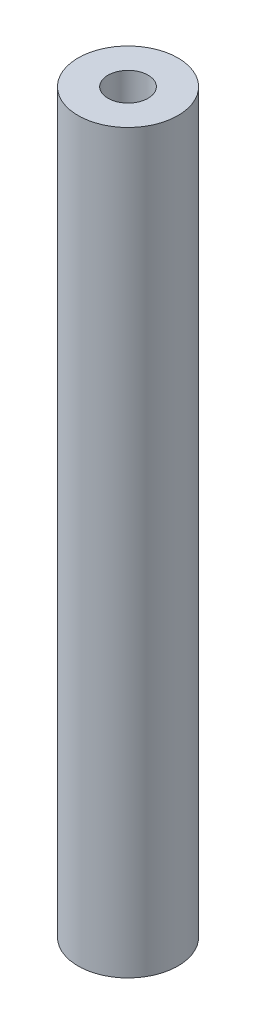
ISO-10303-21;
HEADER;
FILE_DESCRIPTION(('STEP AP214'),'2;1');
FILE_NAME('part.step','',(''),(''),'','','');
FILE_SCHEMA(('AUTOMOTIVE_DESIGN { 1 0 10303 214 1 1 1 1 }'));
ENDSEC;
DATA;
#1=APPLICATION_CONTEXT('core data for automotive mechanical design processes');
#2=APPLICATION_PROTOCOL_DEFINITION('international standard','automotive_design',2000,#1);
#3=PRODUCT_CONTEXT('',#1,'mechanical');
#4=PRODUCT('Part','Part','',(#3));
#5=PRODUCT_RELATED_PRODUCT_CATEGORY('part','',(#4));
#6=PRODUCT_DEFINITION_FORMATION('','',#4);
#7=PRODUCT_DEFINITION_CONTEXT('part definition',#1,'design');
#8=PRODUCT_DEFINITION('design','',#6,#7);
#9=PRODUCT_DEFINITION_SHAPE('','',#8);
#10=(LENGTH_UNIT() NAMED_UNIT(*) SI_UNIT(.MILLI.,.METRE.));
#11=(NAMED_UNIT(*) PLANE_ANGLE_UNIT() SI_UNIT($,.RADIAN.));
#12=(NAMED_UNIT(*) SI_UNIT($,.STERADIAN.) SOLID_ANGLE_UNIT());
#13=UNCERTAINTY_MEASURE_WITH_UNIT(LENGTH_MEASURE(1.E-05),#10,'distance_accuracy_value','');
#14=(GEOMETRIC_REPRESENTATION_CONTEXT(3) GLOBAL_UNCERTAINTY_ASSIGNED_CONTEXT((#13)) GLOBAL_UNIT_ASSIGNED_CONTEXT((#10,
#11,#12)) REPRESENTATION_CONTEXT('',''));
#15=CARTESIAN_POINT('',(0.,0.,0.));
#16=DIRECTION('',(0.,0.,1.));
#17=DIRECTION('',(1.,0.,0.));
#18=AXIS2_PLACEMENT_3D('',#15,#16,#17);
#19=CARTESIAN_POINT('',(0.,93.6625,0.));
#20=DIRECTION('',(0.,-1.,0.));
#21=DIRECTION('',(0.,0.,-1.));
#22=AXIS2_PLACEMENT_3D('',#19,#20,#21);
#23=CYLINDRICAL_SURFACE('',#22,6.35);
#24=CARTESIAN_POINT('',(0.,93.6625,0.));
#25=DIRECTION('',(0.,1.,0.));
#26=DIRECTION('',(0.,0.,1.));
#27=AXIS2_PLACEMENT_3D('',#24,#25,#26);
#28=CIRCLE('',#27,6.35);
#29=CARTESIAN_POINT('',(0.,93.6625,-6.35));
#30=VERTEX_POINT('',#29);
#31=EDGE_CURVE('E11',#30,#30,#28,.T.);
#32=CARTESIAN_POINT('',(0.,0.,0.));
#33=DIRECTION('',(0.,1.,0.));
#34=DIRECTION('',(0.,0.,1.));
#35=AXIS2_PLACEMENT_3D('',#32,#33,#34);
#36=CIRCLE('',#35,6.35);
#37=CARTESIAN_POINT('',(0.,0.,-6.35));
#38=VERTEX_POINT('',#37);
#39=EDGE_CURVE('E50',#38,#38,#36,.T.);
#40=CARTESIAN_POINT('',(0.,93.6625,-6.35));
#41=CARTESIAN_POINT('',(0.,92.6868489583333,-6.35));
#42=CARTESIAN_POINT('',(0.,91.7111979166666,-6.35));
#43=CARTESIAN_POINT('',(0.,89.7598958333333,-6.35));
#44=CARTESIAN_POINT('',(0.,88.7842447916667,-6.35));
#45=CARTESIAN_POINT('',(0.,86.8329427083333,-6.35));
#46=CARTESIAN_POINT('',(0.,85.8572916666667,-6.35));
#47=CARTESIAN_POINT('',(0.,83.9059895833333,-6.35));
#48=CARTESIAN_POINT('',(0.,82.9303385416666,-6.35));
#49=CARTESIAN_POINT('',(0.,80.9790364583333,-6.35));
#50=CARTESIAN_POINT('',(0.,80.0033854166667,-6.35));
#51=CARTESIAN_POINT('',(0.,78.0520833333333,-6.35));
#52=CARTESIAN_POINT('',(0.,77.0764322916667,-6.35));
#53=CARTESIAN_POINT('',(0.,75.1251302083333,-6.35));
#54=CARTESIAN_POINT('',(0.,74.1494791666667,-6.35));
#55=CARTESIAN_POINT('',(0.,72.1981770833333,-6.35));
#56=CARTESIAN_POINT('',(0.,71.2225260416667,-6.35));
#57=CARTESIAN_POINT('',(0.,69.2712239583333,-6.35));
#58=CARTESIAN_POINT('',(0.,68.2955729166667,-6.35));
#59=CARTESIAN_POINT('',(0.,66.3442708333333,-6.35));
#60=CARTESIAN_POINT('',(0.,65.3686197916667,-6.35));
#61=CARTESIAN_POINT('',(0.,63.4173177083333,-6.35));
#62=CARTESIAN_POINT('',(0.,62.4416666666667,-6.35));
#63=CARTESIAN_POINT('',(0.,60.4903645833333,-6.35));
#64=CARTESIAN_POINT('',(0.,59.5147135416667,-6.35));
#65=CARTESIAN_POINT('',(0.,57.5634114583333,-6.35));
#66=CARTESIAN_POINT('',(0.,56.5877604166667,-6.35));
#67=CARTESIAN_POINT('',(0.,54.6364583333333,-6.35));
#68=CARTESIAN_POINT('',(0.,53.6608072916667,-6.35));
#69=CARTESIAN_POINT('',(0.,51.7095052083333,-6.35));
#70=CARTESIAN_POINT('',(0.,50.7338541666667,-6.35));
#71=CARTESIAN_POINT('',(0.,48.7825520833333,-6.35));
#72=CARTESIAN_POINT('',(0.,47.8069010416667,-6.35));
#73=CARTESIAN_POINT('',(0.,45.8555989583333,-6.35));
#74=CARTESIAN_POINT('',(0.,44.8799479166667,-6.35));
#75=CARTESIAN_POINT('',(0.,42.9286458333333,-6.35));
#76=CARTESIAN_POINT('',(0.,41.9529947916667,-6.35));
#77=CARTESIAN_POINT('',(0.,40.0016927083333,-6.35));
#78=CARTESIAN_POINT('',(0.,39.0260416666667,-6.35));
#79=CARTESIAN_POINT('',(0.,37.0747395833333,-6.35));
#80=CARTESIAN_POINT('',(0.,36.0990885416667,-6.35));
#81=CARTESIAN_POINT('',(0.,34.1477864583333,-6.35));
#82=CARTESIAN_POINT('',(0.,33.1721354166667,-6.35));
#83=CARTESIAN_POINT('',(0.,31.2208333333333,-6.35));
#84=CARTESIAN_POINT('',(0.,30.2451822916667,-6.35));
#85=CARTESIAN_POINT('',(0.,28.2938802083333,-6.35));
#86=CARTESIAN_POINT('',(0.,27.3182291666667,-6.35));
#87=CARTESIAN_POINT('',(0.,25.3669270833333,-6.35));
#88=CARTESIAN_POINT('',(0.,24.3912760416667,-6.35));
#89=CARTESIAN_POINT('',(0.,22.4399739583333,-6.35));
#90=CARTESIAN_POINT('',(0.,21.4643229166667,-6.35));
#91=CARTESIAN_POINT('',(0.,19.5130208333333,-6.35));
#92=CARTESIAN_POINT('',(0.,18.5373697916667,-6.35));
#93=CARTESIAN_POINT('',(0.,16.5860677083333,-6.35));
#94=CARTESIAN_POINT('',(0.,15.6104166666667,-6.35));
#95=CARTESIAN_POINT('',(0.,13.6591145833333,-6.35));
#96=CARTESIAN_POINT('',(0.,12.6834635416667,-6.35));
#97=CARTESIAN_POINT('',(0.,10.7321614583333,-6.35));
#98=CARTESIAN_POINT('',(0.,9.75651041666667,-6.35));
#99=CARTESIAN_POINT('',(0.,7.80520833333334,-6.35));
#100=CARTESIAN_POINT('',(0.,6.82955729166667,-6.35));
#101=CARTESIAN_POINT('',(0.,4.87825520833333,-6.35));
#102=CARTESIAN_POINT('',(0.,3.90260416666667,-6.35));
#103=CARTESIAN_POINT('',(0.,1.95130208333334,-6.35));
#104=CARTESIAN_POINT('',(0.,0.975651041666669,-6.35));
#105=CARTESIAN_POINT('',(0.,0.,-6.35));
#106=B_SPLINE_CURVE_WITH_KNOTS('',3,(#40,#41,#42,#43,#44,#45,#46,#47,#48,#49,#50,#51,#52,#53,
#54,#55,#56,#57,#58,#59,#60,#61,#62,#63,#64,#65,#66,#67,#68,#69,#70,#71,#72,#73,#74,#75,#76,#77,
#78,#79,#80,#81,#82,#83,#84,#85,#86,#87,#88,#89,#90,#91,#92,#93,#94,#95,#96,#97,#98,#99,#100,
#101,#102,#103,#104,#105),.UNSPECIFIED.,.F.,.F.,(4,2,2,2,2,2,2,2,2,2,2,2,2,2,2,2,2,2,2,2,2,2,2,
2,2,2,2,2,2,2,2,2,4),(0.,2.92695312499999,5.85390624999999,8.78085937499999,11.7078125,
14.634765625,17.56171875,20.488671875,23.415625,26.342578125,29.26953125,32.196484375,
35.1234375,38.050390625,40.97734375,43.904296875,46.83125,49.758203125,52.68515625,55.612109375,
58.5390625,61.466015625,64.39296875,67.319921875,70.246875,73.173828125,76.10078125,
79.027734375,81.9546875,84.881640625,87.80859375,90.735546875,93.6625),.UNSPECIFIED.);
#107=EDGE_CURVE('BSEAM47',#30,#38,#106,.T.);
#108=ORIENTED_EDGE('',*,*,#31,.F.);
#109=ORIENTED_EDGE('',*,*,#39,.T.);
#110=ORIENTED_EDGE('',*,*,#107,.T.);
#111=ORIENTED_EDGE('',*,*,#107,.F.);
#112=EDGE_LOOP('',(#108,#110,#109,#111));
#113=FACE_BOUND('',#112,.T.);
#114=ADVANCED_FACE('F47',(#113),#23,.T.);
#115=CARTESIAN_POINT('',(0.,93.6625,0.));
#116=DIRECTION('',(0.,1.,0.));
#117=DIRECTION('',(0.,0.,1.));
#118=AXIS2_PLACEMENT_3D('',#115,#116,#117);
#119=PLANE('',#118);
#120=CARTESIAN_POINT('',(0.,93.6625,0.));
#121=DIRECTION('',(0.,1.,0.));
#122=DIRECTION('',(0.,0.,1.));
#123=AXIS2_PLACEMENT_3D('',#120,#121,#122);
#124=CIRCLE('',#123,2.55269999999999);
#125=CARTESIAN_POINT('',(0.,93.6625,2.55269999999999));
#126=VERTEX_POINT('',#125);
#127=EDGE_CURVE('E72',#126,#126,#124,.T.);
#128=ORIENTED_EDGE('',*,*,#127,.F.);
#129=EDGE_LOOP('',(#128));
#130=FACE_BOUND('',#129,.T.);
#131=ORIENTED_EDGE('',*,*,#31,.T.);
#132=EDGE_LOOP('',(#131));
#133=FACE_BOUND('',#132,.T.);
#134=ADVANCED_FACE('F95',(#130,#133),#119,.T.);
#135=CARTESIAN_POINT('',(0.,0.,0.));
#136=DIRECTION('',(0.,1.,0.));
#137=DIRECTION('',(0.,0.,1.));
#138=AXIS2_PLACEMENT_3D('',#135,#136,#137);
#139=PLANE('',#138);
#140=CARTESIAN_POINT('',(0.,0.,0.));
#141=DIRECTION('',(0.,-1.,0.));
#142=DIRECTION('',(0.,0.,-1.));
#143=AXIS2_PLACEMENT_3D('',#140,#141,#142);
#144=CIRCLE('',#143,2.55269999999999);
#145=CARTESIAN_POINT('',(0.,0.,-2.55269999999999));
#146=VERTEX_POINT('',#145);
#147=EDGE_CURVE('E73',#146,#146,#144,.T.);
#148=ORIENTED_EDGE('',*,*,#147,.F.);
#149=EDGE_LOOP('',(#148));
#150=FACE_BOUND('',#149,.T.);
#151=ORIENTED_EDGE('',*,*,#39,.F.);
#152=EDGE_LOOP('',(#151));
#153=FACE_BOUND('',#152,.T.);
#154=ADVANCED_FACE('F92',(#150,#153),#139,.F.);
#155=CARTESIAN_POINT('',(0.,68.2625,0.));
#156=DIRECTION('',(0.,1.,0.));
#157=DIRECTION('',(0.,0.,1.));
#158=AXIS2_PLACEMENT_3D('',#155,#156,#157);
#159=CONICAL_SURFACE('',#158,2.55269999999999,1.02974425867665);
#160=CARTESIAN_POINT('',(0.,66.7286830978083,0.));
#161=VERTEX_POINT('',#160);
#162=VERTEX_LOOP('',#161);
#163=FACE_BOUND('',#162,.T.);
#164=CARTESIAN_POINT('',(0.,68.2625,0.));
#165=DIRECTION('',(0.,1.,0.));
#166=DIRECTION('',(0.,0.,1.));
#167=AXIS2_PLACEMENT_3D('',#164,#165,#166);
#168=CIRCLE('',#167,2.55269999999999);
#169=CARTESIAN_POINT('',(0.,68.2625,2.55269999999999));
#170=VERTEX_POINT('',#169);
#171=EDGE_CURVE('E78',#170,#170,#168,.T.);
#172=ORIENTED_EDGE('',*,*,#171,.T.);
#173=EDGE_LOOP('',(#172));
#174=FACE_BOUND('',#173,.T.);
#175=ADVANCED_FACE('F94',(#163,#174),#159,.F.);
#176=CARTESIAN_POINT('',(0.,93.6625,0.));
#177=DIRECTION('',(0.,1.,0.));
#178=DIRECTION('',(0.,0.,1.));
#179=AXIS2_PLACEMENT_3D('',#176,#177,#178);
#180=CYLINDRICAL_SURFACE('',#179,2.55269999999999);
#181=ORIENTED_EDGE('',*,*,#171,.F.);
#182=EDGE_LOOP('',(#181));
#183=FACE_BOUND('',#182,.T.);
#184=ORIENTED_EDGE('',*,*,#127,.T.);
#185=EDGE_LOOP('',(#184));
#186=FACE_BOUND('',#185,.T.);
#187=ADVANCED_FACE('F65',(#183,#186),#180,.F.);
#188=CARTESIAN_POINT('',(0.,25.4,0.));
#189=DIRECTION('',(0.,-1.,0.));
#190=DIRECTION('',(0.,0.,-1.));
#191=AXIS2_PLACEMENT_3D('',#188,#189,#190);
#192=CONICAL_SURFACE('',#191,2.55269999999999,1.02974425867665);
#193=CARTESIAN_POINT('',(0.,26.9338169021917,0.));
#194=VERTEX_POINT('',#193);
#195=VERTEX_LOOP('',#194);
#196=FACE_BOUND('',#195,.T.);
#197=CARTESIAN_POINT('',(0.,25.4,0.));
#198=DIRECTION('',(0.,-1.,0.));
#199=DIRECTION('',(0.,0.,-1.));
#200=AXIS2_PLACEMENT_3D('',#197,#198,#199);
#201=CIRCLE('',#200,2.55269999999999);
#202=CARTESIAN_POINT('',(0.,25.4,-2.55269999999999));
#203=VERTEX_POINT('',#202);
#204=EDGE_CURVE('E69',#203,#203,#201,.T.);
#205=ORIENTED_EDGE('',*,*,#204,.T.);
#206=EDGE_LOOP('',(#205));
#207=FACE_BOUND('',#206,.T.);
#208=ADVANCED_FACE('F61',(#196,#207),#192,.F.);
#209=CARTESIAN_POINT('',(0.,0.,0.));
#210=DIRECTION('',(0.,-1.,0.));
#211=DIRECTION('',(0.,0.,-1.));
#212=AXIS2_PLACEMENT_3D('',#209,#210,#211);
#213=CYLINDRICAL_SURFACE('',#212,2.55269999999999);
#214=ORIENTED_EDGE('',*,*,#204,.F.);
#215=EDGE_LOOP('',(#214));
#216=FACE_BOUND('',#215,.T.);
#217=ORIENTED_EDGE('',*,*,#147,.T.);
#218=EDGE_LOOP('',(#217));
#219=FACE_BOUND('',#218,.T.);
#220=ADVANCED_FACE('F64',(#216,#219),#213,.F.);
#221=CLOSED_SHELL('',(#114,#134,#154,#175,#187,#208,#220));
#222=MANIFOLD_SOLID_BREP('B2',#221);
#223=ADVANCED_BREP_SHAPE_REPRESENTATION('',(#18,#222),#14);
#224=SHAPE_DEFINITION_REPRESENTATION(#9,#223);
ENDSEC;
END-ISO-10303-21;
